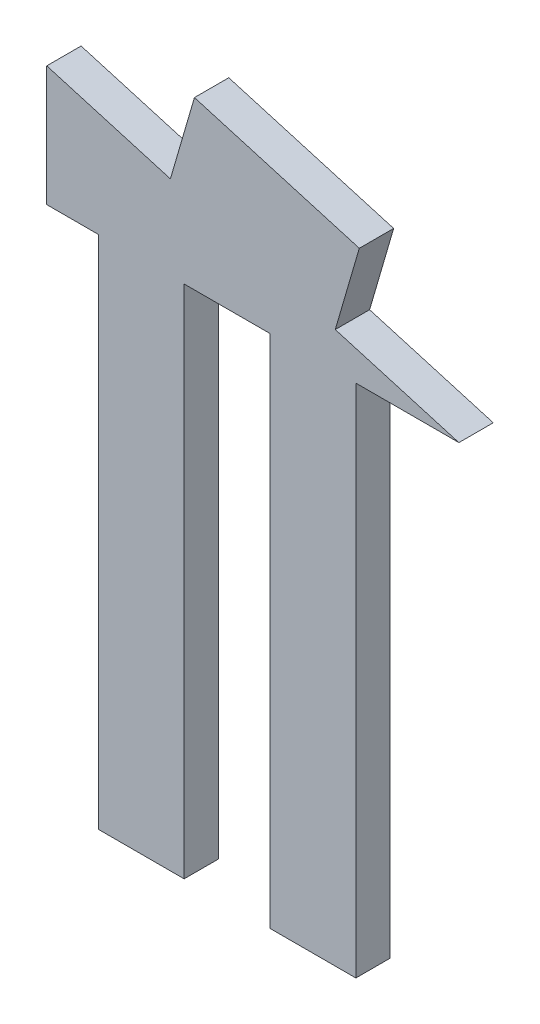
ISO-10303-21;
HEADER;
FILE_DESCRIPTION(('STEP AP214'),'2;1');
FILE_NAME('part.step','',(''),(''),'','','');
FILE_SCHEMA(('AUTOMOTIVE_DESIGN { 1 0 10303 214 1 1 1 1 }'));
ENDSEC;
DATA;
#1=APPLICATION_CONTEXT('core data for automotive mechanical design processes');
#2=APPLICATION_PROTOCOL_DEFINITION('international standard','automotive_design',2000,#1);
#3=PRODUCT_CONTEXT('',#1,'mechanical');
#4=PRODUCT('Part','Part','',(#3));
#5=PRODUCT_RELATED_PRODUCT_CATEGORY('part','',(#4));
#6=PRODUCT_DEFINITION_FORMATION('','',#4);
#7=PRODUCT_DEFINITION_CONTEXT('part definition',#1,'design');
#8=PRODUCT_DEFINITION('design','',#6,#7);
#9=PRODUCT_DEFINITION_SHAPE('','',#8);
#10=(LENGTH_UNIT() NAMED_UNIT(*) SI_UNIT(.MILLI.,.METRE.));
#11=(NAMED_UNIT(*) PLANE_ANGLE_UNIT() SI_UNIT($,.RADIAN.));
#12=(NAMED_UNIT(*) SI_UNIT($,.STERADIAN.) SOLID_ANGLE_UNIT());
#13=UNCERTAINTY_MEASURE_WITH_UNIT(LENGTH_MEASURE(1.E-05),#10,'distance_accuracy_value','');
#14=(GEOMETRIC_REPRESENTATION_CONTEXT(3) GLOBAL_UNCERTAINTY_ASSIGNED_CONTEXT((#13)) GLOBAL_UNIT_ASSIGNED_CONTEXT((#10,
#11,#12)) REPRESENTATION_CONTEXT('',''));
#15=CARTESIAN_POINT('',(0.,0.,0.));
#16=DIRECTION('',(0.,0.,1.));
#17=DIRECTION('',(1.,0.,0.));
#18=AXIS2_PLACEMENT_3D('',#15,#16,#17);
#19=CARTESIAN_POINT('',(3.,0.,2.));
#20=DIRECTION('',(1.,0.,0.));
#21=DIRECTION('',(0.,1.,0.));
#22=AXIS2_PLACEMENT_3D('',#19,#20,#21);
#23=PLANE('',#22);
#24=DIRECTION('',(0.,-1.,0.));
#25=VECTOR('',#24,1.);
#26=CARTESIAN_POINT('',(3.,0.,0.));
#27=LINE('',#26,#25);
#28=CARTESIAN_POINT('',(3.,0.,0.));
#29=VERTEX_POINT('',#28);
#30=CARTESIAN_POINT('',(3.00000000000001,-30.,0.));
#31=VERTEX_POINT('',#30);
#32=EDGE_CURVE('E248',#29,#31,#27,.T.);
#33=ORIENTED_EDGE('',*,*,#32,.T.);
#34=DIRECTION('',(0.,0.,-1.));
#35=VECTOR('',#34,1.);
#36=CARTESIAN_POINT('',(3.00000000000001,-30.,0.));
#37=LINE('',#36,#35);
#38=CARTESIAN_POINT('',(3.00000000000001,-30.,2.));
#39=VERTEX_POINT('',#38);
#40=EDGE_CURVE('E279',#39,#31,#37,.T.);
#41=ORIENTED_EDGE('',*,*,#40,.F.);
#42=DIRECTION('',(0.,-1.,0.));
#43=VECTOR('',#42,1.);
#44=CARTESIAN_POINT('',(3.,0.,2.));
#45=LINE('',#44,#43);
#46=CARTESIAN_POINT('',(3.,0.,2.));
#47=VERTEX_POINT('',#46);
#48=EDGE_CURVE('E247',#47,#39,#45,.T.);
#49=ORIENTED_EDGE('',*,*,#48,.F.);
#50=DIRECTION('',(0.,0.,-1.));
#51=VECTOR('',#50,1.);
#52=CARTESIAN_POINT('',(3.,0.,2.));
#53=LINE('',#52,#51);
#54=EDGE_CURVE('E245',#47,#29,#53,.T.);
#55=ORIENTED_EDGE('',*,*,#54,.T.);
#56=EDGE_LOOP('',(#33,#41,#49,#55));
#57=FACE_BOUND('',#56,.T.);
#58=ADVANCED_FACE('F80',(#57),#23,.F.);
#59=CARTESIAN_POINT('',(0.,0.,2.));
#60=DIRECTION('',(0.,1.,0.));
#61=DIRECTION('',(0.,0.,1.));
#62=AXIS2_PLACEMENT_3D('',#59,#60,#61);
#63=PLANE('',#62);
#64=DIRECTION('',(1.,0.,0.));
#65=VECTOR('',#64,1.);
#66=CARTESIAN_POINT('',(0.,0.,0.));
#67=LINE('',#66,#65);
#68=CARTESIAN_POINT('',(0.,0.,0.));
#69=VERTEX_POINT('',#68);
#70=EDGE_CURVE('E216',#69,#29,#67,.T.);
#71=ORIENTED_EDGE('',*,*,#70,.T.);
#72=ORIENTED_EDGE('',*,*,#54,.F.);
#73=DIRECTION('',(1.,0.,0.));
#74=VECTOR('',#73,1.);
#75=CARTESIAN_POINT('',(0.,0.,2.));
#76=LINE('',#75,#74);
#77=CARTESIAN_POINT('',(0.,0.,2.));
#78=VERTEX_POINT('',#77);
#79=EDGE_CURVE('E290',#78,#47,#76,.T.);
#80=ORIENTED_EDGE('',*,*,#79,.F.);
#81=DIRECTION('',(0.,0.,-1.));
#82=VECTOR('',#81,1.);
#83=CARTESIAN_POINT('',(0.,0.,2.));
#84=LINE('',#83,#82);
#85=EDGE_CURVE('E242',#78,#69,#84,.T.);
#86=ORIENTED_EDGE('',*,*,#85,.T.);
#87=EDGE_LOOP('',(#71,#72,#80,#86));
#88=FACE_BOUND('',#87,.T.);
#89=ADVANCED_FACE('F364',(#88),#63,.F.);
#90=CARTESIAN_POINT('',(18.,0.,2.));
#91=DIRECTION('',(1.,0.,0.));
#92=DIRECTION('',(0.,1.,0.));
#93=AXIS2_PLACEMENT_3D('',#90,#91,#92);
#94=PLANE('',#93);
#95=DIRECTION('',(0.,0.,1.));
#96=VECTOR('',#95,1.);
#97=CARTESIAN_POINT('',(18.,-30.,0.));
#98=LINE('',#97,#96);
#99=CARTESIAN_POINT('',(18.,-30.,0.));
#100=VERTEX_POINT('',#99);
#101=CARTESIAN_POINT('',(18.,-30.,2.));
#102=VERTEX_POINT('',#101);
#103=EDGE_CURVE('E97',#100,#102,#98,.T.);
#104=ORIENTED_EDGE('',*,*,#103,.F.);
#105=DIRECTION('',(0.,-1.,0.));
#106=VECTOR('',#105,1.);
#107=CARTESIAN_POINT('',(18.,0.,0.));
#108=LINE('',#107,#106);
#109=CARTESIAN_POINT('',(18.,0.,0.));
#110=VERTEX_POINT('',#109);
#111=EDGE_CURVE('E204',#110,#100,#108,.T.);
#112=ORIENTED_EDGE('',*,*,#111,.F.);
#113=DIRECTION('',(0.,0.,-1.));
#114=VECTOR('',#113,1.);
#115=CARTESIAN_POINT('',(18.,0.,2.));
#116=LINE('',#115,#114);
#117=CARTESIAN_POINT('',(18.,0.,2.));
#118=VERTEX_POINT('',#117);
#119=EDGE_CURVE('E234',#118,#110,#116,.T.);
#120=ORIENTED_EDGE('',*,*,#119,.F.);
#121=DIRECTION('',(0.,-1.,0.));
#122=VECTOR('',#121,1.);
#123=CARTESIAN_POINT('',(18.,0.,2.));
#124=LINE('',#123,#122);
#125=EDGE_CURVE('E293',#118,#102,#124,.T.);
#126=ORIENTED_EDGE('',*,*,#125,.T.);
#127=EDGE_LOOP('',(#104,#112,#120,#126));
#128=FACE_BOUND('',#127,.T.);
#129=ADVANCED_FACE('F371',(#128),#94,.T.);
#130=CARTESIAN_POINT('',(13.,0.,2.));
#131=DIRECTION('',(1.,0.,0.));
#132=DIRECTION('',(0.,1.,0.));
#133=AXIS2_PLACEMENT_3D('',#130,#131,#132);
#134=PLANE('',#133);
#135=DIRECTION('',(0.,-1.,0.));
#136=VECTOR('',#135,1.);
#137=CARTESIAN_POINT('',(13.,0.,0.));
#138=LINE('',#137,#136);
#139=CARTESIAN_POINT('',(13.,0.,0.));
#140=VERTEX_POINT('',#139);
#141=CARTESIAN_POINT('',(13.,-30.,0.));
#142=VERTEX_POINT('',#141);
#143=EDGE_CURVE('E201',#140,#142,#138,.T.);
#144=ORIENTED_EDGE('',*,*,#143,.T.);
#145=DIRECTION('',(0.,0.,-1.));
#146=VECTOR('',#145,1.);
#147=CARTESIAN_POINT('',(13.,-30.,0.));
#148=LINE('',#147,#146);
#149=CARTESIAN_POINT('',(13.,-30.,2.));
#150=VERTEX_POINT('',#149);
#151=EDGE_CURVE('E186',#150,#142,#148,.T.);
#152=ORIENTED_EDGE('',*,*,#151,.F.);
#153=DIRECTION('',(0.,-1.,0.));
#154=VECTOR('',#153,1.);
#155=CARTESIAN_POINT('',(13.,0.,2.));
#156=LINE('',#155,#154);
#157=CARTESIAN_POINT('',(13.,0.,2.));
#158=VERTEX_POINT('',#157);
#159=EDGE_CURVE('E289',#158,#150,#156,.T.);
#160=ORIENTED_EDGE('',*,*,#159,.F.);
#161=DIRECTION('',(0.,0.,-1.));
#162=VECTOR('',#161,1.);
#163=CARTESIAN_POINT('',(13.,0.,2.));
#164=LINE('',#163,#162);
#165=EDGE_CURVE('E209',#158,#140,#164,.T.);
#166=ORIENTED_EDGE('',*,*,#165,.T.);
#167=EDGE_LOOP('',(#144,#152,#160,#166));
#168=FACE_BOUND('',#167,.T.);
#169=ADVANCED_FACE('F207',(#168),#134,.F.);
#170=CARTESIAN_POINT('',(8.,0.,0.));
#171=VERTEX_POINT('',#170);
#172=EDGE_CURVE('E210',#171,#140,#67,.T.);
#173=ORIENTED_EDGE('',*,*,#172,.T.);
#174=ORIENTED_EDGE('',*,*,#165,.F.);
#175=CARTESIAN_POINT('',(8.,0.,2.));
#176=VERTEX_POINT('',#175);
#177=EDGE_CURVE('E255',#176,#158,#76,.T.);
#178=ORIENTED_EDGE('',*,*,#177,.F.);
#179=DIRECTION('',(0.,0.,-1.));
#180=VECTOR('',#179,1.);
#181=CARTESIAN_POINT('',(8.,0.,2.));
#182=LINE('',#181,#180);
#183=EDGE_CURVE('E231',#176,#171,#182,.T.);
#184=ORIENTED_EDGE('',*,*,#183,.T.);
#185=EDGE_LOOP('',(#173,#174,#178,#184));
#186=FACE_BOUND('',#185,.T.);
#187=ADVANCED_FACE('F373',(#186),#63,.F.);
#188=CARTESIAN_POINT('',(8.,0.,2.));
#189=DIRECTION('',(1.,0.,0.));
#190=DIRECTION('',(0.,1.,0.));
#191=AXIS2_PLACEMENT_3D('',#188,#189,#190);
#192=PLANE('',#191);
#193=DIRECTION('',(0.,0.,1.));
#194=VECTOR('',#193,1.);
#195=CARTESIAN_POINT('',(8.00000000000001,-30.,0.));
#196=LINE('',#195,#194);
#197=CARTESIAN_POINT('',(8.00000000000001,-30.,0.));
#198=VERTEX_POINT('',#197);
#199=CARTESIAN_POINT('',(8.,-30.,2.));
#200=VERTEX_POINT('',#199);
#201=EDGE_CURVE('E105',#198,#200,#196,.T.);
#202=ORIENTED_EDGE('',*,*,#201,.F.);
#203=DIRECTION('',(0.,-1.,0.));
#204=VECTOR('',#203,1.);
#205=CARTESIAN_POINT('',(8.,0.,0.));
#206=LINE('',#205,#204);
#207=EDGE_CURVE('E214',#171,#198,#206,.T.);
#208=ORIENTED_EDGE('',*,*,#207,.F.);
#209=ORIENTED_EDGE('',*,*,#183,.F.);
#210=DIRECTION('',(0.,-1.,0.));
#211=VECTOR('',#210,1.);
#212=CARTESIAN_POINT('',(8.,0.,2.));
#213=LINE('',#212,#211);
#214=EDGE_CURVE('E250',#176,#200,#213,.T.);
#215=ORIENTED_EDGE('',*,*,#214,.T.);
#216=EDGE_LOOP('',(#202,#208,#209,#215));
#217=FACE_BOUND('',#216,.T.);
#218=ADVANCED_FACE('F385',(#217),#192,.T.);
#219=CARTESIAN_POINT('',(24.,0.,0.));
#220=VERTEX_POINT('',#219);
#221=EDGE_CURVE('E212',#110,#220,#67,.T.);
#222=ORIENTED_EDGE('',*,*,#221,.T.);
#223=DIRECTION('',(0.,0.,-1.));
#224=VECTOR('',#223,1.);
#225=CARTESIAN_POINT('',(24.,0.,2.));
#226=LINE('',#225,#224);
#227=CARTESIAN_POINT('',(24.,0.,2.));
#228=VERTEX_POINT('',#227);
#229=EDGE_CURVE('E236',#228,#220,#226,.T.);
#230=ORIENTED_EDGE('',*,*,#229,.F.);
#231=EDGE_CURVE('E291',#118,#228,#76,.T.);
#232=ORIENTED_EDGE('',*,*,#231,.F.);
#233=ORIENTED_EDGE('',*,*,#119,.T.);
#234=EDGE_LOOP('',(#222,#230,#232,#233));
#235=FACE_BOUND('',#234,.T.);
#236=ADVANCED_FACE('F374',(#235),#63,.F.);
#237=CARTESIAN_POINT('',(0.,0.,2.));
#238=DIRECTION('',(1.,0.,0.));
#239=DIRECTION('',(0.,1.,0.));
#240=AXIS2_PLACEMENT_3D('',#237,#238,#239);
#241=PLANE('',#240);
#242=DIRECTION('',(0.,-1.,0.));
#243=VECTOR('',#242,1.);
#244=CARTESIAN_POINT('',(0.,0.,0.));
#245=LINE('',#244,#243);
#246=CARTESIAN_POINT('',(0.,7.,0.));
#247=VERTEX_POINT('',#246);
#248=EDGE_CURVE('E221',#247,#69,#245,.T.);
#249=ORIENTED_EDGE('',*,*,#248,.T.);
#250=ORIENTED_EDGE('',*,*,#85,.F.);
#251=DIRECTION('',(0.,-1.,0.));
#252=VECTOR('',#251,1.);
#253=CARTESIAN_POINT('',(0.,0.,2.));
#254=LINE('',#253,#252);
#255=CARTESIAN_POINT('',(0.,7.,2.));
#256=VERTEX_POINT('',#255);
#257=EDGE_CURVE('E274',#256,#78,#254,.T.);
#258=ORIENTED_EDGE('',*,*,#257,.F.);
#259=DIRECTION('',(0.,0.,-1.));
#260=VECTOR('',#259,1.);
#261=CARTESIAN_POINT('',(0.,7.,2.));
#262=LINE('',#261,#260);
#263=EDGE_CURVE('E239',#256,#247,#262,.T.);
#264=ORIENTED_EDGE('',*,*,#263,.T.);
#265=EDGE_LOOP('',(#249,#250,#258,#264));
#266=FACE_BOUND('',#265,.T.);
#267=ADVANCED_FACE('F272',(#266),#241,.F.);
#268=CARTESIAN_POINT('',(0.,0.,0.));
#269=DIRECTION('',(0.,0.,1.));
#270=DIRECTION('',(1.,0.,0.));
#271=AXIS2_PLACEMENT_3D('',#268,#269,#270);
#272=PLANE('',#271);
#273=ORIENTED_EDGE('',*,*,#111,.T.);
#274=DIRECTION('',(1.,0.,0.));
#275=VECTOR('',#274,1.);
#276=CARTESIAN_POINT('',(13.,-30.,0.));
#277=LINE('',#276,#275);
#278=EDGE_CURVE('E189',#142,#100,#277,.T.);
#279=ORIENTED_EDGE('',*,*,#278,.F.);
#280=ORIENTED_EDGE('',*,*,#143,.F.);
#281=ORIENTED_EDGE('',*,*,#172,.F.);
#282=ORIENTED_EDGE('',*,*,#207,.T.);
#283=DIRECTION('',(1.,0.,0.));
#284=VECTOR('',#283,1.);
#285=CARTESIAN_POINT('',(3.00000000000001,-30.,0.));
#286=LINE('',#285,#284);
#287=EDGE_CURVE('E277',#31,#198,#286,.T.);
#288=ORIENTED_EDGE('',*,*,#287,.F.);
#289=ORIENTED_EDGE('',*,*,#32,.F.);
#290=ORIENTED_EDGE('',*,*,#70,.F.);
#291=ORIENTED_EDGE('',*,*,#248,.F.);
#292=DIRECTION('',(-0.96,0.28,0.));
#293=VECTOR('',#292,1.);
#294=CARTESIAN_POINT('',(1.8816,6.4512,0.));
#295=LINE('',#294,#293);
#296=CARTESIAN_POINT('',(7.2,4.9,0.));
#297=VERTEX_POINT('',#296);
#298=EDGE_CURVE('E225',#297,#247,#295,.T.);
#299=ORIENTED_EDGE('',*,*,#298,.F.);
#300=DIRECTION('',(0.28,0.96,0.));
#301=VECTOR('',#300,1.);
#302=CARTESIAN_POINT('',(7.2,4.9,0.));
#303=LINE('',#302,#301);
#304=CARTESIAN_POINT('',(8.6,9.7,0.));
#305=VERTEX_POINT('',#304);
#306=EDGE_CURVE('E286',#297,#305,#303,.T.);
#307=ORIENTED_EDGE('',*,*,#306,.T.);
#308=DIRECTION('',(0.96,-0.28,0.));
#309=VECTOR('',#308,1.);
#310=CARTESIAN_POINT('',(8.6,9.7,0.));
#311=LINE('',#310,#309);
#312=CARTESIAN_POINT('',(18.2,6.9,0.));
#313=VERTEX_POINT('',#312);
#314=EDGE_CURVE('E335',#305,#313,#311,.T.);
#315=ORIENTED_EDGE('',*,*,#314,.T.);
#316=DIRECTION('',(0.28,0.96,0.));
#317=VECTOR('',#316,1.);
#318=CARTESIAN_POINT('',(16.8,2.1,0.));
#319=LINE('',#318,#317);
#320=CARTESIAN_POINT('',(16.8,2.1,0.));
#321=VERTEX_POINT('',#320);
#322=EDGE_CURVE('E331',#321,#313,#319,.T.);
#323=ORIENTED_EDGE('',*,*,#322,.F.);
#324=EDGE_CURVE('E228',#220,#321,#295,.T.);
#325=ORIENTED_EDGE('',*,*,#324,.F.);
#326=ORIENTED_EDGE('',*,*,#221,.F.);
#327=EDGE_LOOP('',(#273,#279,#280,#281,#282,#288,#289,#290,#291,#299,#307,#315,#323,#325,#326));
#328=FACE_BOUND('',#327,.T.);
#329=ADVANCED_FACE('F199',(#328),#272,.F.);
#330=CARTESIAN_POINT('',(0.,0.,2.));
#331=DIRECTION('',(0.,0.,1.));
#332=DIRECTION('',(1.,0.,0.));
#333=AXIS2_PLACEMENT_3D('',#330,#331,#332);
#334=PLANE('',#333);
#335=DIRECTION('',(-1.,0.,0.));
#336=VECTOR('',#335,1.);
#337=CARTESIAN_POINT('',(13.,-30.,2.));
#338=LINE('',#337,#336);
#339=EDGE_CURVE('E190',#102,#150,#338,.T.);
#340=ORIENTED_EDGE('',*,*,#339,.F.);
#341=ORIENTED_EDGE('',*,*,#125,.F.);
#342=ORIENTED_EDGE('',*,*,#231,.T.);
#343=DIRECTION('',(-0.96,0.28,0.));
#344=VECTOR('',#343,1.);
#345=CARTESIAN_POINT('',(1.8816,6.4512,2.));
#346=LINE('',#345,#344);
#347=CARTESIAN_POINT('',(16.8,2.1,2.));
#348=VERTEX_POINT('',#347);
#349=EDGE_CURVE('E303',#228,#348,#346,.T.);
#350=ORIENTED_EDGE('',*,*,#349,.T.);
#351=DIRECTION('',(0.28,0.96,0.));
#352=VECTOR('',#351,1.);
#353=CARTESIAN_POINT('',(16.8,2.1,2.));
#354=LINE('',#353,#352);
#355=CARTESIAN_POINT('',(18.2,6.9,2.));
#356=VERTEX_POINT('',#355);
#357=EDGE_CURVE('E321',#348,#356,#354,.T.);
#358=ORIENTED_EDGE('',*,*,#357,.T.);
#359=DIRECTION('',(0.96,-0.28,0.));
#360=VECTOR('',#359,1.);
#361=CARTESIAN_POINT('',(8.6,9.7,2.));
#362=LINE('',#361,#360);
#363=CARTESIAN_POINT('',(8.6,9.7,2.));
#364=VERTEX_POINT('',#363);
#365=EDGE_CURVE('E330',#364,#356,#362,.T.);
#366=ORIENTED_EDGE('',*,*,#365,.F.);
#367=DIRECTION('',(0.28,0.96,0.));
#368=VECTOR('',#367,1.);
#369=CARTESIAN_POINT('',(7.2,4.9,2.));
#370=LINE('',#369,#368);
#371=CARTESIAN_POINT('',(7.2,4.9,2.));
#372=VERTEX_POINT('',#371);
#373=EDGE_CURVE('E327',#372,#364,#370,.T.);
#374=ORIENTED_EDGE('',*,*,#373,.F.);
#375=EDGE_CURVE('E301',#372,#256,#346,.T.);
#376=ORIENTED_EDGE('',*,*,#375,.T.);
#377=ORIENTED_EDGE('',*,*,#257,.T.);
#378=ORIENTED_EDGE('',*,*,#79,.T.);
#379=ORIENTED_EDGE('',*,*,#48,.T.);
#380=DIRECTION('',(-1.,0.,0.));
#381=VECTOR('',#380,1.);
#382=CARTESIAN_POINT('',(3.00000000000001,-30.,2.));
#383=LINE('',#382,#381);
#384=EDGE_CURVE('E281',#200,#39,#383,.T.);
#385=ORIENTED_EDGE('',*,*,#384,.F.);
#386=ORIENTED_EDGE('',*,*,#214,.F.);
#387=ORIENTED_EDGE('',*,*,#177,.T.);
#388=ORIENTED_EDGE('',*,*,#159,.T.);
#389=EDGE_LOOP('',(#340,#341,#342,#350,#358,#366,#374,#376,#377,#378,#379,#385,#386,#387,#388));
#390=FACE_BOUND('',#389,.T.);
#391=ADVANCED_FACE('F348',(#390),#334,.T.);
#392=CARTESIAN_POINT('',(1.8816,6.4512,2.));
#393=DIRECTION('',(-0.28,-0.96,0.));
#394=DIRECTION('',(0.96,-0.28,0.));
#395=AXIS2_PLACEMENT_3D('',#392,#393,#394);
#396=PLANE('',#395);
#397=ORIENTED_EDGE('',*,*,#375,.F.);
#398=DIRECTION('',(0.,0.,-1.));
#399=VECTOR('',#398,1.);
#400=CARTESIAN_POINT('',(7.2,4.9,2.));
#401=LINE('',#400,#399);
#402=EDGE_CURVE('E89',#372,#297,#401,.T.);
#403=ORIENTED_EDGE('',*,*,#402,.T.);
#404=ORIENTED_EDGE('',*,*,#298,.T.);
#405=ORIENTED_EDGE('',*,*,#263,.F.);
#406=EDGE_LOOP('',(#397,#403,#404,#405));
#407=FACE_BOUND('',#406,.T.);
#408=ADVANCED_FACE('F266',(#407),#396,.F.);
#409=DIRECTION('',(0.,0.,-1.));
#410=VECTOR('',#409,1.);
#411=CARTESIAN_POINT('',(16.8,2.1,2.));
#412=LINE('',#411,#410);
#413=EDGE_CURVE('E12',#348,#321,#412,.T.);
#414=ORIENTED_EDGE('',*,*,#413,.F.);
#415=ORIENTED_EDGE('',*,*,#349,.F.);
#416=ORIENTED_EDGE('',*,*,#229,.T.);
#417=ORIENTED_EDGE('',*,*,#324,.T.);
#418=EDGE_LOOP('',(#414,#415,#416,#417));
#419=FACE_BOUND('',#418,.T.);
#420=ADVANCED_FACE('F353',(#419),#396,.F.);
#421=CARTESIAN_POINT('',(8.6,9.7,2.));
#422=DIRECTION('',(0.28,0.96,0.));
#423=DIRECTION('',(-0.96,0.28,0.));
#424=AXIS2_PLACEMENT_3D('',#421,#422,#423);
#425=PLANE('',#424);
#426=ORIENTED_EDGE('',*,*,#314,.F.);
#427=DIRECTION('',(0.,0.,-1.));
#428=VECTOR('',#427,1.);
#429=CARTESIAN_POINT('',(8.6,9.7,2.));
#430=LINE('',#429,#428);
#431=EDGE_CURVE('E314',#364,#305,#430,.T.);
#432=ORIENTED_EDGE('',*,*,#431,.F.);
#433=ORIENTED_EDGE('',*,*,#365,.T.);
#434=DIRECTION('',(0.,0.,-1.));
#435=VECTOR('',#434,1.);
#436=CARTESIAN_POINT('',(18.2,6.9,2.));
#437=LINE('',#436,#435);
#438=EDGE_CURVE('E313',#356,#313,#437,.T.);
#439=ORIENTED_EDGE('',*,*,#438,.T.);
#440=EDGE_LOOP('',(#426,#432,#433,#439));
#441=FACE_BOUND('',#440,.T.);
#442=ADVANCED_FACE('F347',(#441),#425,.T.);
#443=CARTESIAN_POINT('',(7.2,4.9,2.));
#444=DIRECTION('',(-0.96,0.28,0.));
#445=DIRECTION('',(-0.28,-0.96,0.));
#446=AXIS2_PLACEMENT_3D('',#443,#444,#445);
#447=PLANE('',#446);
#448=ORIENTED_EDGE('',*,*,#306,.F.);
#449=ORIENTED_EDGE('',*,*,#402,.F.);
#450=ORIENTED_EDGE('',*,*,#373,.T.);
#451=ORIENTED_EDGE('',*,*,#431,.T.);
#452=EDGE_LOOP('',(#448,#449,#450,#451));
#453=FACE_BOUND('',#452,.T.);
#454=ADVANCED_FACE('F82',(#453),#447,.T.);
#455=CARTESIAN_POINT('',(16.8,2.1,2.));
#456=DIRECTION('',(-0.96,0.28,0.));
#457=DIRECTION('',(-0.28,-0.96,0.));
#458=AXIS2_PLACEMENT_3D('',#455,#456,#457);
#459=PLANE('',#458);
#460=ORIENTED_EDGE('',*,*,#322,.T.);
#461=ORIENTED_EDGE('',*,*,#438,.F.);
#462=ORIENTED_EDGE('',*,*,#357,.F.);
#463=ORIENTED_EDGE('',*,*,#413,.T.);
#464=EDGE_LOOP('',(#460,#461,#462,#463));
#465=FACE_BOUND('',#464,.T.);
#466=ADVANCED_FACE('F352',(#465),#459,.F.);
#467=CARTESIAN_POINT('',(0.,-30.,0.));
#468=DIRECTION('',(0.,1.,0.));
#469=DIRECTION('',(0.,0.,1.));
#470=AXIS2_PLACEMENT_3D('',#467,#468,#469);
#471=PLANE('',#470);
#472=ORIENTED_EDGE('',*,*,#40,.T.);
#473=ORIENTED_EDGE('',*,*,#287,.T.);
#474=ORIENTED_EDGE('',*,*,#201,.T.);
#475=ORIENTED_EDGE('',*,*,#384,.T.);
#476=EDGE_LOOP('',(#472,#473,#474,#475));
#477=FACE_BOUND('',#476,.T.);
#478=ADVANCED_FACE('F358',(#477),#471,.F.);
#479=CARTESIAN_POINT('',(0.,-30.,0.));
#480=DIRECTION('',(0.,1.,0.));
#481=DIRECTION('',(0.,0.,1.));
#482=AXIS2_PLACEMENT_3D('',#479,#480,#481);
#483=PLANE('',#482);
#484=ORIENTED_EDGE('',*,*,#151,.T.);
#485=ORIENTED_EDGE('',*,*,#278,.T.);
#486=ORIENTED_EDGE('',*,*,#103,.T.);
#487=ORIENTED_EDGE('',*,*,#339,.T.);
#488=EDGE_LOOP('',(#484,#485,#486,#487));
#489=FACE_BOUND('',#488,.T.);
#490=ADVANCED_FACE('F188',(#489),#483,.F.);
#491=CLOSED_SHELL('',(#58,#89,#129,#169,#187,#218,#236,#267,#329,#391,#408,#420,#442,#454,#466,
#478,#490));
#492=MANIFOLD_SOLID_BREP('B2',#491);
#493=ADVANCED_BREP_SHAPE_REPRESENTATION('',(#18,#492),#14);
#494=SHAPE_DEFINITION_REPRESENTATION(#9,#493);
ENDSEC;
END-ISO-10303-21;
